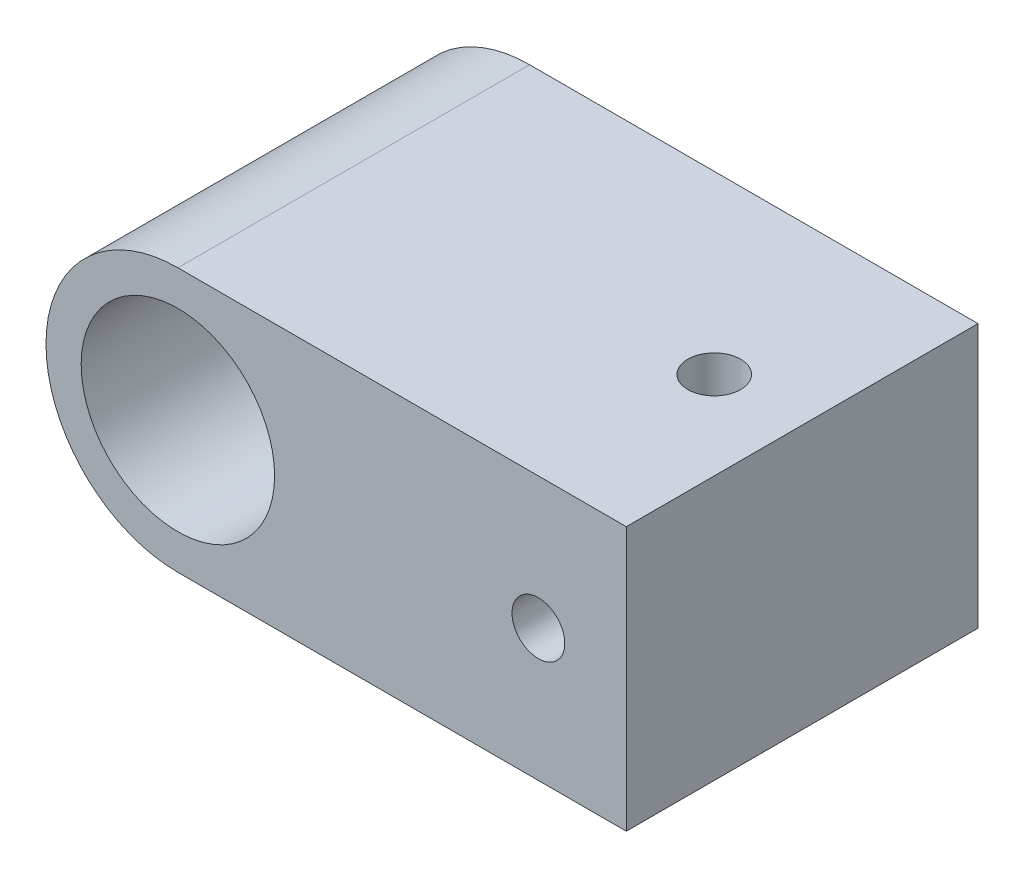
ISO-10303-21;
HEADER;
FILE_DESCRIPTION(('STEP AP214'),'2;1');
FILE_NAME('part.step','',(''),(''),'','','');
FILE_SCHEMA(('AUTOMOTIVE_DESIGN { 1 0 10303 214 1 1 1 1 }'));
ENDSEC;
DATA;
#1=APPLICATION_CONTEXT('core data for automotive mechanical design processes');
#2=APPLICATION_PROTOCOL_DEFINITION('international standard','automotive_design',2000,#1);
#3=PRODUCT_CONTEXT('',#1,'mechanical');
#4=PRODUCT('Part','Part','',(#3));
#5=PRODUCT_RELATED_PRODUCT_CATEGORY('part','',(#4));
#6=PRODUCT_DEFINITION_FORMATION('','',#4);
#7=PRODUCT_DEFINITION_CONTEXT('part definition',#1,'design');
#8=PRODUCT_DEFINITION('design','',#6,#7);
#9=PRODUCT_DEFINITION_SHAPE('','',#8);
#10=(LENGTH_UNIT() NAMED_UNIT(*) SI_UNIT(.MILLI.,.METRE.));
#11=(NAMED_UNIT(*) PLANE_ANGLE_UNIT() SI_UNIT($,.RADIAN.));
#12=(NAMED_UNIT(*) SI_UNIT($,.STERADIAN.) SOLID_ANGLE_UNIT());
#13=UNCERTAINTY_MEASURE_WITH_UNIT(LENGTH_MEASURE(1.E-05),#10,'distance_accuracy_value','');
#14=(GEOMETRIC_REPRESENTATION_CONTEXT(3) GLOBAL_UNCERTAINTY_ASSIGNED_CONTEXT((#13)) GLOBAL_UNIT_ASSIGNED_CONTEXT((#10,
#11,#12)) REPRESENTATION_CONTEXT('',''));
#15=CARTESIAN_POINT('',(0.,0.,0.));
#16=DIRECTION('',(0.,0.,1.));
#17=DIRECTION('',(1.,0.,0.));
#18=AXIS2_PLACEMENT_3D('',#15,#16,#17);
#19=CARTESIAN_POINT('',(20.5,-22.5,10.));
#20=DIRECTION('',(0.,1.,0.));
#21=DIRECTION('',(0.,0.,1.));
#22=AXIS2_PLACEMENT_3D('',#19,#20,#21);
#23=CYLINDRICAL_SURFACE('',#22,1.5);
#24=CARTESIAN_POINT('',(20.5,7.5,10.));
#25=DIRECTION('',(0.,1.,0.));
#26=DIRECTION('',(0.,0.,1.));
#27=AXIS2_PLACEMENT_3D('',#24,#25,#26);
#28=CIRCLE('',#27,1.5);
#29=CARTESIAN_POINT('',(20.5,7.5,11.5));
#30=VERTEX_POINT('',#29);
#31=EDGE_CURVE('E130',#30,#30,#28,.T.);
#32=ORIENTED_EDGE('',*,*,#31,.T.);
#33=EDGE_LOOP('',(#32));
#34=FACE_BOUND('',#33,.T.);
#35=CARTESIAN_POINT('',(20.5,0.,10.));
#36=DIRECTION('',(0.,0.707106781186547,0.707106781186547));
#37=DIRECTION('',(0.,0.707106781186547,-0.707106781186547));
#38=AXIS2_PLACEMENT_3D('',#35,#36,#37);
#39=ELLIPSE('',#38,2.12132034355964,1.5);
#40=CARTESIAN_POINT('',(19.,0.,10.));
#41=VERTEX_POINT('',#40);
#42=CARTESIAN_POINT('',(22.,0.,10.));
#43=VERTEX_POINT('',#42);
#44=EDGE_CURVE('E47',#41,#43,#39,.F.);
#45=ORIENTED_EDGE('',*,*,#44,.T.);
#46=CARTESIAN_POINT('',(20.5,0.,10.));
#47=DIRECTION('',(0.,0.707106781186547,-0.707106781186547));
#48=DIRECTION('',(0.,0.707106781186547,0.707106781186547));
#49=AXIS2_PLACEMENT_3D('',#46,#47,#48);
#50=ELLIPSE('',#49,2.12132034355964,1.5);
#51=EDGE_CURVE('E11',#43,#41,#50,.F.);
#52=ORIENTED_EDGE('',*,*,#51,.T.);
#53=EDGE_LOOP('',(#45,#52));
#54=FACE_BOUND('',#53,.T.);
#55=ADVANCED_FACE('F34',(#34,#54),#23,.F.);
#56=CARTESIAN_POINT('',(0.,0.,20.));
#57=DIRECTION('',(0.,0.,-1.));
#58=DIRECTION('',(-1.,0.,0.));
#59=AXIS2_PLACEMENT_3D('',#56,#57,#58);
#60=CYLINDRICAL_SURFACE('',#59,7.5);
#61=DIRECTION('',(0.,0.,-1.));
#62=VECTOR('',#61,1.);
#63=CARTESIAN_POINT('',(0.,-7.5,20.));
#64=LINE('',#63,#62);
#65=CARTESIAN_POINT('',(0.,-7.5,20.));
#66=VERTEX_POINT('',#65);
#67=CARTESIAN_POINT('',(0.,-7.5,0.));
#68=VERTEX_POINT('',#67);
#69=EDGE_CURVE('E55',#66,#68,#64,.T.);
#70=ORIENTED_EDGE('',*,*,#69,.F.);
#71=CARTESIAN_POINT('',(0.,0.,20.));
#72=DIRECTION('',(0.,0.,1.));
#73=DIRECTION('',(1.,0.,0.));
#74=AXIS2_PLACEMENT_3D('',#71,#72,#73);
#75=CIRCLE('',#74,7.5);
#76=CARTESIAN_POINT('',(0.,7.5,20.));
#77=VERTEX_POINT('',#76);
#78=EDGE_CURVE('E88',#77,#66,#75,.T.);
#79=ORIENTED_EDGE('',*,*,#78,.F.);
#80=DIRECTION('',(0.,0.,1.));
#81=VECTOR('',#80,1.);
#82=CARTESIAN_POINT('',(0.,7.5,20.));
#83=LINE('',#82,#81);
#84=CARTESIAN_POINT('',(0.,7.5,0.));
#85=VERTEX_POINT('',#84);
#86=EDGE_CURVE('E113',#85,#77,#83,.T.);
#87=ORIENTED_EDGE('',*,*,#86,.F.);
#88=CARTESIAN_POINT('',(0.,0.,0.));
#89=DIRECTION('',(0.,0.,1.));
#90=DIRECTION('',(1.,0.,0.));
#91=AXIS2_PLACEMENT_3D('',#88,#89,#90);
#92=CIRCLE('',#91,7.5);
#93=EDGE_CURVE('E97',#85,#68,#92,.T.);
#94=ORIENTED_EDGE('',*,*,#93,.T.);
#95=EDGE_LOOP('',(#70,#79,#87,#94));
#96=FACE_BOUND('',#95,.T.);
#97=ADVANCED_FACE('F36',(#96),#60,.T.);
#98=CARTESIAN_POINT('',(0.,0.,20.));
#99=DIRECTION('',(0.,0.,1.));
#100=DIRECTION('',(1.,0.,0.));
#101=AXIS2_PLACEMENT_3D('',#98,#99,#100);
#102=PLANE('',#101);
#103=CARTESIAN_POINT('',(20.5,0.,20.));
#104=DIRECTION('',(0.,0.,1.));
#105=DIRECTION('',(1.,0.,0.));
#106=AXIS2_PLACEMENT_3D('',#103,#104,#105);
#107=CIRCLE('',#106,1.5);
#108=CARTESIAN_POINT('',(22.,0.,20.));
#109=VERTEX_POINT('',#108);
#110=EDGE_CURVE('E133',#109,#109,#107,.T.);
#111=ORIENTED_EDGE('',*,*,#110,.F.);
#112=EDGE_LOOP('',(#111));
#113=FACE_BOUND('',#112,.T.);
#114=CARTESIAN_POINT('',(0.,0.,20.));
#115=DIRECTION('',(0.,0.,1.));
#116=DIRECTION('',(1.,0.,0.));
#117=AXIS2_PLACEMENT_3D('',#114,#115,#116);
#118=CIRCLE('',#117,5.5);
#119=CARTESIAN_POINT('',(5.5,0.,20.));
#120=VERTEX_POINT('',#119);
#121=EDGE_CURVE('E96',#120,#120,#118,.T.);
#122=ORIENTED_EDGE('',*,*,#121,.F.);
#123=EDGE_LOOP('',(#122));
#124=FACE_BOUND('',#123,.T.);
#125=ORIENTED_EDGE('',*,*,#78,.T.);
#126=DIRECTION('',(-1.,0.,0.));
#127=VECTOR('',#126,1.);
#128=CARTESIAN_POINT('',(25.5,-7.5,20.));
#129=LINE('',#128,#127);
#130=CARTESIAN_POINT('',(25.5,-7.5,20.));
#131=VERTEX_POINT('',#130);
#132=EDGE_CURVE('E99',#131,#66,#129,.T.);
#133=ORIENTED_EDGE('',*,*,#132,.F.);
#134=DIRECTION('',(0.,-1.,0.));
#135=VECTOR('',#134,1.);
#136=CARTESIAN_POINT('',(25.5,7.5,20.));
#137=LINE('',#136,#135);
#138=CARTESIAN_POINT('',(25.5,7.5,20.));
#139=VERTEX_POINT('',#138);
#140=EDGE_CURVE('E116',#139,#131,#137,.T.);
#141=ORIENTED_EDGE('',*,*,#140,.F.);
#142=DIRECTION('',(-1.,0.,0.));
#143=VECTOR('',#142,1.);
#144=CARTESIAN_POINT('',(25.5,7.5,20.));
#145=LINE('',#144,#143);
#146=EDGE_CURVE('E109',#139,#77,#145,.T.);
#147=ORIENTED_EDGE('',*,*,#146,.T.);
#148=EDGE_LOOP('',(#125,#133,#141,#147));
#149=FACE_BOUND('',#148,.T.);
#150=ADVANCED_FACE('F145',(#113,#124,#149),#102,.T.);
#151=CARTESIAN_POINT('',(0.,0.,0.));
#152=DIRECTION('',(0.,0.,1.));
#153=DIRECTION('',(1.,0.,0.));
#154=AXIS2_PLACEMENT_3D('',#151,#152,#153);
#155=PLANE('',#154);
#156=CARTESIAN_POINT('',(20.5,0.,0.));
#157=DIRECTION('',(0.,0.,-1.));
#158=DIRECTION('',(-1.,0.,0.));
#159=AXIS2_PLACEMENT_3D('',#156,#157,#158);
#160=CIRCLE('',#159,1.5);
#161=CARTESIAN_POINT('',(19.,0.,0.));
#162=VERTEX_POINT('',#161);
#163=EDGE_CURVE('E136',#162,#162,#160,.T.);
#164=ORIENTED_EDGE('',*,*,#163,.F.);
#165=EDGE_LOOP('',(#164));
#166=FACE_BOUND('',#165,.T.);
#167=CARTESIAN_POINT('',(0.,0.,0.));
#168=DIRECTION('',(0.,0.,1.));
#169=DIRECTION('',(1.,0.,0.));
#170=AXIS2_PLACEMENT_3D('',#167,#168,#169);
#171=CIRCLE('',#170,5.5);
#172=CARTESIAN_POINT('',(5.5,0.,0.));
#173=VERTEX_POINT('',#172);
#174=EDGE_CURVE('E93',#173,#173,#171,.T.);
#175=ORIENTED_EDGE('',*,*,#174,.T.);
#176=EDGE_LOOP('',(#175));
#177=FACE_BOUND('',#176,.T.);
#178=ORIENTED_EDGE('',*,*,#93,.F.);
#179=DIRECTION('',(-1.,0.,0.));
#180=VECTOR('',#179,1.);
#181=CARTESIAN_POINT('',(25.5,7.5,0.));
#182=LINE('',#181,#180);
#183=CARTESIAN_POINT('',(25.5,7.5,0.));
#184=VERTEX_POINT('',#183);
#185=EDGE_CURVE('E106',#184,#85,#182,.T.);
#186=ORIENTED_EDGE('',*,*,#185,.F.);
#187=DIRECTION('',(0.,1.,0.));
#188=VECTOR('',#187,1.);
#189=CARTESIAN_POINT('',(25.5,7.5,0.));
#190=LINE('',#189,#188);
#191=CARTESIAN_POINT('',(25.5,-7.5,0.));
#192=VERTEX_POINT('',#191);
#193=EDGE_CURVE('E119',#192,#184,#190,.T.);
#194=ORIENTED_EDGE('',*,*,#193,.F.);
#195=DIRECTION('',(-1.,0.,0.));
#196=VECTOR('',#195,1.);
#197=CARTESIAN_POINT('',(25.5,-7.5,0.));
#198=LINE('',#197,#196);
#199=EDGE_CURVE('E103',#192,#68,#198,.T.);
#200=ORIENTED_EDGE('',*,*,#199,.T.);
#201=EDGE_LOOP('',(#178,#186,#194,#200));
#202=FACE_BOUND('',#201,.T.);
#203=ADVANCED_FACE('F141',(#166,#177,#202),#155,.F.);
#204=CARTESIAN_POINT('',(25.5,-7.5,20.));
#205=DIRECTION('',(0.,1.,0.));
#206=DIRECTION('',(0.,0.,1.));
#207=AXIS2_PLACEMENT_3D('',#204,#205,#206);
#208=PLANE('',#207);
#209=CARTESIAN_POINT('',(20.5,-7.5,10.));
#210=DIRECTION('',(0.,1.,0.));
#211=DIRECTION('',(0.,0.,1.));
#212=AXIS2_PLACEMENT_3D('',#209,#210,#211);
#213=CIRCLE('',#212,1.5);
#214=CARTESIAN_POINT('',(20.5,-7.5,11.5));
#215=VERTEX_POINT('',#214);
#216=EDGE_CURVE('E127',#215,#215,#213,.T.);
#217=ORIENTED_EDGE('',*,*,#216,.T.);
#218=EDGE_LOOP('',(#217));
#219=FACE_BOUND('',#218,.T.);
#220=ORIENTED_EDGE('',*,*,#69,.T.);
#221=ORIENTED_EDGE('',*,*,#199,.F.);
#222=DIRECTION('',(0.,0.,-1.));
#223=VECTOR('',#222,1.);
#224=CARTESIAN_POINT('',(25.5,-7.5,20.));
#225=LINE('',#224,#223);
#226=EDGE_CURVE('E121',#131,#192,#225,.T.);
#227=ORIENTED_EDGE('',*,*,#226,.F.);
#228=ORIENTED_EDGE('',*,*,#132,.T.);
#229=EDGE_LOOP('',(#220,#221,#227,#228));
#230=FACE_BOUND('',#229,.T.);
#231=ADVANCED_FACE('F144',(#219,#230),#208,.F.);
#232=CARTESIAN_POINT('',(25.5,7.5,20.));
#233=DIRECTION('',(0.,-1.,0.));
#234=DIRECTION('',(0.,0.,-1.));
#235=AXIS2_PLACEMENT_3D('',#232,#233,#234);
#236=PLANE('',#235);
#237=ORIENTED_EDGE('',*,*,#31,.F.);
#238=EDGE_LOOP('',(#237));
#239=FACE_BOUND('',#238,.T.);
#240=ORIENTED_EDGE('',*,*,#86,.T.);
#241=ORIENTED_EDGE('',*,*,#146,.F.);
#242=DIRECTION('',(0.,0.,1.));
#243=VECTOR('',#242,1.);
#244=CARTESIAN_POINT('',(25.5,7.5,20.));
#245=LINE('',#244,#243);
#246=EDGE_CURVE('E112',#184,#139,#245,.T.);
#247=ORIENTED_EDGE('',*,*,#246,.F.);
#248=ORIENTED_EDGE('',*,*,#185,.T.);
#249=EDGE_LOOP('',(#240,#241,#247,#248));
#250=FACE_BOUND('',#249,.T.);
#251=ADVANCED_FACE('F154',(#239,#250),#236,.F.);
#252=CARTESIAN_POINT('',(25.5,0.,0.));
#253=DIRECTION('',(1.,0.,0.));
#254=DIRECTION('',(0.,0.,-1.));
#255=AXIS2_PLACEMENT_3D('',#252,#253,#254);
#256=PLANE('',#255);
#257=ORIENTED_EDGE('',*,*,#140,.T.);
#258=ORIENTED_EDGE('',*,*,#226,.T.);
#259=ORIENTED_EDGE('',*,*,#193,.T.);
#260=ORIENTED_EDGE('',*,*,#246,.T.);
#261=EDGE_LOOP('',(#257,#258,#259,#260));
#262=FACE_BOUND('',#261,.T.);
#263=ADVANCED_FACE('F158',(#262),#256,.T.);
#264=CARTESIAN_POINT('',(0.,0.,-6.));
#265=DIRECTION('',(0.,0.,1.));
#266=DIRECTION('',(1.,0.,0.));
#267=AXIS2_PLACEMENT_3D('',#264,#265,#266);
#268=CYLINDRICAL_SURFACE('',#267,5.5);
#269=ORIENTED_EDGE('',*,*,#121,.T.);
#270=EDGE_LOOP('',(#269));
#271=FACE_BOUND('',#270,.T.);
#272=ORIENTED_EDGE('',*,*,#174,.F.);
#273=EDGE_LOOP('',(#272));
#274=FACE_BOUND('',#273,.T.);
#275=ADVANCED_FACE('F176',(#271,#274),#268,.F.);
#276=CARTESIAN_POINT('',(20.5,0.,10.));
#277=DIRECTION('',(0.,0.707106781186547,0.707106781186547));
#278=DIRECTION('',(0.,0.707106781186547,-0.707106781186547));
#279=AXIS2_PLACEMENT_3D('',#276,#277,#278);
#280=ELLIPSE('',#279,2.12132034355964,1.5);
#281=EDGE_CURVE('E81',#41,#43,#280,.T.);
#282=ORIENTED_EDGE('',*,*,#281,.T.);
#283=CARTESIAN_POINT('',(20.5,0.,10.));
#284=DIRECTION('',(0.,0.707106781186547,-0.707106781186547));
#285=DIRECTION('',(0.,0.707106781186547,0.707106781186547));
#286=AXIS2_PLACEMENT_3D('',#283,#284,#285);
#287=ELLIPSE('',#286,2.12132034355964,1.5);
#288=EDGE_CURVE('E42',#43,#41,#287,.T.);
#289=ORIENTED_EDGE('',*,*,#288,.T.);
#290=EDGE_LOOP('',(#282,#289));
#291=FACE_BOUND('',#290,.T.);
#292=ORIENTED_EDGE('',*,*,#216,.F.);
#293=EDGE_LOOP('',(#292));
#294=FACE_BOUND('',#293,.T.);
#295=ADVANCED_FACE('F90',(#291,#294),#23,.F.);
#296=CARTESIAN_POINT('',(20.5,0.,30.));
#297=DIRECTION('',(0.,0.,-1.));
#298=DIRECTION('',(-1.,0.,0.));
#299=AXIS2_PLACEMENT_3D('',#296,#297,#298);
#300=CYLINDRICAL_SURFACE('',#299,1.5);
#301=ORIENTED_EDGE('',*,*,#163,.T.);
#302=EDGE_LOOP('',(#301));
#303=FACE_BOUND('',#302,.T.);
#304=ORIENTED_EDGE('',*,*,#44,.F.);
#305=ORIENTED_EDGE('',*,*,#288,.F.);
#306=EDGE_LOOP('',(#304,#305));
#307=FACE_BOUND('',#306,.T.);
#308=ADVANCED_FACE('F87',(#303,#307),#300,.F.);
#309=ORIENTED_EDGE('',*,*,#110,.T.);
#310=EDGE_LOOP('',(#309));
#311=FACE_BOUND('',#310,.T.);
#312=ORIENTED_EDGE('',*,*,#281,.F.);
#313=ORIENTED_EDGE('',*,*,#51,.F.);
#314=EDGE_LOOP('',(#312,#313));
#315=FACE_BOUND('',#314,.T.);
#316=ADVANCED_FACE('F82',(#311,#315),#300,.F.);
#317=CLOSED_SHELL('',(#55,#97,#150,#203,#231,#251,#263,#275,#295,#308,#316));
#318=MANIFOLD_SOLID_BREP('B2',#317);
#319=ADVANCED_BREP_SHAPE_REPRESENTATION('',(#18,#318),#14);
#320=SHAPE_DEFINITION_REPRESENTATION(#9,#319);
ENDSEC;
END-ISO-10303-21;
